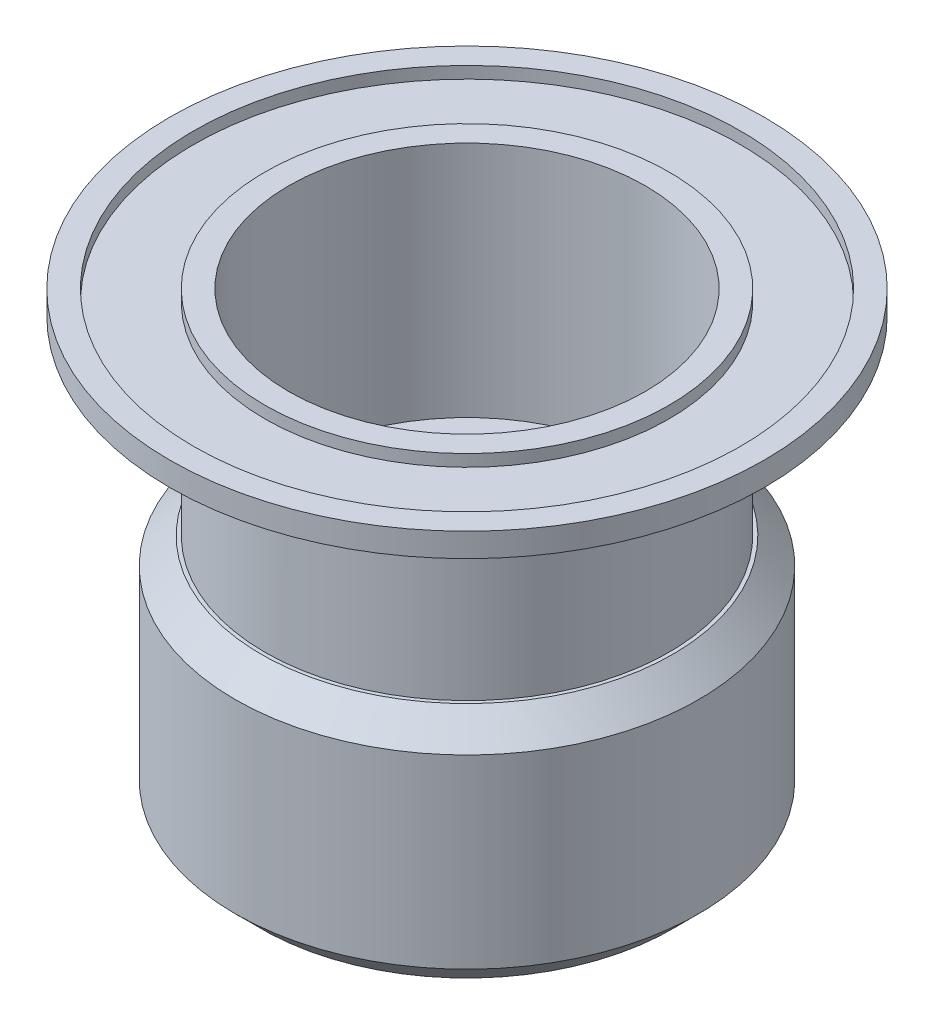
ISO-10303-21;
HEADER;
FILE_DESCRIPTION(('STEP AP214'),'2;1');
FILE_NAME('part.step','',(''),(''),'','','');
FILE_SCHEMA(('AUTOMOTIVE_DESIGN { 1 0 10303 214 1 1 1 1 }'));
ENDSEC;
DATA;
#1=APPLICATION_CONTEXT('core data for automotive mechanical design processes');
#2=APPLICATION_PROTOCOL_DEFINITION('international standard','automotive_design',2000,#1);
#3=PRODUCT_CONTEXT('',#1,'mechanical');
#4=PRODUCT('Part','Part','',(#3));
#5=PRODUCT_RELATED_PRODUCT_CATEGORY('part','',(#4));
#6=PRODUCT_DEFINITION_FORMATION('','',#4);
#7=PRODUCT_DEFINITION_CONTEXT('part definition',#1,'design');
#8=PRODUCT_DEFINITION('design','',#6,#7);
#9=PRODUCT_DEFINITION_SHAPE('','',#8);
#10=(LENGTH_UNIT() NAMED_UNIT(*) SI_UNIT(.MILLI.,.METRE.));
#11=(NAMED_UNIT(*) PLANE_ANGLE_UNIT() SI_UNIT($,.RADIAN.));
#12=(NAMED_UNIT(*) SI_UNIT($,.STERADIAN.) SOLID_ANGLE_UNIT());
#13=UNCERTAINTY_MEASURE_WITH_UNIT(LENGTH_MEASURE(1.E-05),#10,'distance_accuracy_value','');
#14=(GEOMETRIC_REPRESENTATION_CONTEXT(3) GLOBAL_UNCERTAINTY_ASSIGNED_CONTEXT((#13)) GLOBAL_UNIT_ASSIGNED_CONTEXT((#10,
#11,#12)) REPRESENTATION_CONTEXT('',''));
#15=CARTESIAN_POINT('',(0.,0.,0.));
#16=DIRECTION('',(0.,0.,1.));
#17=DIRECTION('',(1.,0.,0.));
#18=AXIS2_PLACEMENT_3D('',#15,#16,#17);
#19=CARTESIAN_POINT('',(0.,0.,0.));
#20=DIRECTION('',(0.,1.,0.));
#21=DIRECTION('',(0.,0.,1.));
#22=AXIS2_PLACEMENT_3D('',#19,#20,#21);
#23=CYLINDRICAL_SURFACE('',#22,17.);
#24=CARTESIAN_POINT('',(0.,-2.,0.));
#25=DIRECTION('',(0.,1.,0.));
#26=DIRECTION('',(0.,0.,1.));
#27=AXIS2_PLACEMENT_3D('',#24,#25,#26);
#28=CIRCLE('',#27,17.);
#29=CARTESIAN_POINT('',(0.,-2.,17.));
#30=VERTEX_POINT('',#29);
#31=EDGE_CURVE('E134',#30,#30,#28,.T.);
#32=ORIENTED_EDGE('',*,*,#31,.F.);
#33=EDGE_LOOP('',(#32));
#34=FACE_BOUND('',#33,.T.);
#35=CARTESIAN_POINT('',(0.,-18.,0.));
#36=DIRECTION('',(0.,-1.,0.));
#37=DIRECTION('',(0.,0.,-1.));
#38=AXIS2_PLACEMENT_3D('',#35,#36,#37);
#39=CIRCLE('',#38,17.);
#40=CARTESIAN_POINT('',(0.,-18.,-17.));
#41=VERTEX_POINT('',#40);
#42=EDGE_CURVE('E146',#41,#41,#39,.T.);
#43=ORIENTED_EDGE('',*,*,#42,.F.);
#44=EDGE_LOOP('',(#43));
#45=FACE_BOUND('',#44,.T.);
#46=ADVANCED_FACE('F36',(#34,#45),#23,.T.);
#47=CARTESIAN_POINT('',(15.,0.,0.));
#48=DIRECTION('',(0.,-1.,0.));
#49=DIRECTION('',(0.,0.,-1.));
#50=AXIS2_PLACEMENT_3D('',#47,#48,#49);
#51=PLANE('',#50);
#52=CARTESIAN_POINT('',(0.,0.,0.));
#53=DIRECTION('',(0.,1.,0.));
#54=DIRECTION('',(0.,0.,1.));
#55=AXIS2_PLACEMENT_3D('',#52,#53,#54);
#56=CIRCLE('',#55,23.);
#57=CARTESIAN_POINT('',(0.,0.,23.));
#58=VERTEX_POINT('',#57);
#59=EDGE_CURVE('E120',#58,#58,#56,.T.);
#60=ORIENTED_EDGE('',*,*,#59,.F.);
#61=EDGE_LOOP('',(#60));
#62=FACE_BOUND('',#61,.T.);
#63=CARTESIAN_POINT('',(0.,0.,0.));
#64=DIRECTION('',(0.,1.,0.));
#65=DIRECTION('',(0.,0.,1.));
#66=AXIS2_PLACEMENT_3D('',#63,#64,#65);
#67=CIRCLE('',#66,25.);
#68=CARTESIAN_POINT('',(0.,0.,25.));
#69=VERTEX_POINT('',#68);
#70=EDGE_CURVE('E140',#69,#69,#67,.T.);
#71=ORIENTED_EDGE('',*,*,#70,.T.);
#72=EDGE_LOOP('',(#71));
#73=FACE_BOUND('',#72,.T.);
#74=ADVANCED_FACE('F239',(#62,#73),#51,.F.);
#75=CARTESIAN_POINT('',(0.,0.,0.));
#76=DIRECTION('',(0.,1.,0.));
#77=DIRECTION('',(0.,0.,1.));
#78=AXIS2_PLACEMENT_3D('',#75,#76,#77);
#79=CYLINDRICAL_SURFACE('',#78,25.);
#80=ORIENTED_EDGE('',*,*,#70,.F.);
#81=EDGE_LOOP('',(#80));
#82=FACE_BOUND('',#81,.T.);
#83=CARTESIAN_POINT('',(0.,-2.,0.));
#84=DIRECTION('',(0.,1.,0.));
#85=DIRECTION('',(0.,0.,1.));
#86=AXIS2_PLACEMENT_3D('',#83,#84,#85);
#87=CIRCLE('',#86,25.);
#88=CARTESIAN_POINT('',(0.,-2.,25.));
#89=VERTEX_POINT('',#88);
#90=EDGE_CURVE('E137',#89,#89,#87,.T.);
#91=ORIENTED_EDGE('',*,*,#90,.T.);
#92=EDGE_LOOP('',(#91));
#93=FACE_BOUND('',#92,.T.);
#94=ADVANCED_FACE('F259',(#82,#93),#79,.T.);
#95=CARTESIAN_POINT('',(17.,-2.,0.));
#96=DIRECTION('',(0.,1.,0.));
#97=DIRECTION('',(0.,0.,1.));
#98=AXIS2_PLACEMENT_3D('',#95,#96,#97);
#99=PLANE('',#98);
#100=ORIENTED_EDGE('',*,*,#90,.F.);
#101=EDGE_LOOP('',(#100));
#102=FACE_BOUND('',#101,.T.);
#103=ORIENTED_EDGE('',*,*,#31,.T.);
#104=EDGE_LOOP('',(#103));
#105=FACE_BOUND('',#104,.T.);
#106=ADVANCED_FACE('F264',(#102,#105),#99,.F.);
#107=CARTESIAN_POINT('',(0.,-1.,0.));
#108=DIRECTION('',(0.,1.,0.));
#109=DIRECTION('',(0.,0.,1.));
#110=AXIS2_PLACEMENT_3D('',#107,#108,#109);
#111=CYLINDRICAL_SURFACE('',#110,23.);
#112=CARTESIAN_POINT('',(0.,-1.,0.));
#113=DIRECTION('',(0.,1.,0.));
#114=DIRECTION('',(0.,0.,1.));
#115=AXIS2_PLACEMENT_3D('',#112,#113,#114);
#116=CIRCLE('',#115,23.);
#117=CARTESIAN_POINT('',(0.,-1.,23.));
#118=VERTEX_POINT('',#117);
#119=EDGE_CURVE('E123',#118,#118,#116,.T.);
#120=ORIENTED_EDGE('',*,*,#119,.F.);
#121=EDGE_LOOP('',(#120));
#122=FACE_BOUND('',#121,.T.);
#123=ORIENTED_EDGE('',*,*,#59,.T.);
#124=EDGE_LOOP('',(#123));
#125=FACE_BOUND('',#124,.T.);
#126=ADVANCED_FACE('F249',(#122,#125),#111,.F.);
#127=CARTESIAN_POINT('',(0.,-1.,0.));
#128=DIRECTION('',(0.,1.,0.));
#129=DIRECTION('',(0.,0.,1.));
#130=AXIS2_PLACEMENT_3D('',#127,#128,#129);
#131=PLANE('',#130);
#132=CARTESIAN_POINT('',(0.,-1.,0.));
#133=DIRECTION('',(0.,1.,0.));
#134=DIRECTION('',(0.,0.,1.));
#135=AXIS2_PLACEMENT_3D('',#132,#133,#134);
#136=CIRCLE('',#135,17.);
#137=CARTESIAN_POINT('',(0.,-1.,17.));
#138=VERTEX_POINT('',#137);
#139=EDGE_CURVE('E117',#138,#138,#136,.T.);
#140=ORIENTED_EDGE('',*,*,#139,.F.);
#141=EDGE_LOOP('',(#140));
#142=FACE_BOUND('',#141,.T.);
#143=ORIENTED_EDGE('',*,*,#119,.T.);
#144=EDGE_LOOP('',(#143));
#145=FACE_BOUND('',#144,.T.);
#146=ADVANCED_FACE('F243',(#142,#145),#131,.T.);
#147=CARTESIAN_POINT('',(0.,-1.,0.));
#148=DIRECTION('',(0.,1.,0.));
#149=DIRECTION('',(0.,0.,1.));
#150=AXIS2_PLACEMENT_3D('',#147,#148,#149);
#151=CYLINDRICAL_SURFACE('',#150,17.);
#152=ORIENTED_EDGE('',*,*,#139,.T.);
#153=EDGE_LOOP('',(#152));
#154=FACE_BOUND('',#153,.T.);
#155=CARTESIAN_POINT('',(0.,0.,0.));
#156=DIRECTION('',(0.,1.,0.));
#157=DIRECTION('',(0.,0.,1.));
#158=AXIS2_PLACEMENT_3D('',#155,#156,#157);
#159=CIRCLE('',#158,17.);
#160=CARTESIAN_POINT('',(0.,0.,17.));
#161=VERTEX_POINT('',#160);
#162=EDGE_CURVE('E114',#161,#161,#159,.T.);
#163=ORIENTED_EDGE('',*,*,#162,.F.);
#164=EDGE_LOOP('',(#163));
#165=FACE_BOUND('',#164,.T.);
#166=ADVANCED_FACE('F223',(#154,#165),#151,.T.);
#167=CARTESIAN_POINT('',(15.,-20.,0.));
#168=DIRECTION('',(0.,-1.,0.));
#169=DIRECTION('',(0.,0.,-1.));
#170=AXIS2_PLACEMENT_3D('',#167,#168,#169);
#171=PLANE('',#170);
#172=CARTESIAN_POINT('',(-10.,-20.,0.));
#173=DIRECTION('',(0.,1.,0.));
#174=DIRECTION('',(0.,0.,1.));
#175=AXIS2_PLACEMENT_3D('',#172,#173,#174);
#176=CIRCLE('',#175,4.);
#177=CARTESIAN_POINT('',(-10.,-20.,4.));
#178=VERTEX_POINT('',#177);
#179=EDGE_CURVE('E205',#178,#178,#176,.T.);
#180=ORIENTED_EDGE('',*,*,#179,.F.);
#181=EDGE_LOOP('',(#180));
#182=FACE_BOUND('',#181,.T.);
#183=CARTESIAN_POINT('',(0.,-20.,10.));
#184=DIRECTION('',(0.,1.,0.));
#185=DIRECTION('',(0.,0.,1.));
#186=AXIS2_PLACEMENT_3D('',#183,#184,#185);
#187=CIRCLE('',#186,4.);
#188=CARTESIAN_POINT('',(0.,-20.,14.));
#189=VERTEX_POINT('',#188);
#190=EDGE_CURVE('E208',#189,#189,#187,.T.);
#191=ORIENTED_EDGE('',*,*,#190,.F.);
#192=EDGE_LOOP('',(#191));
#193=FACE_BOUND('',#192,.T.);
#194=CARTESIAN_POINT('',(10.,-20.,0.));
#195=DIRECTION('',(0.,1.,0.));
#196=DIRECTION('',(0.,0.,1.));
#197=AXIS2_PLACEMENT_3D('',#194,#195,#196);
#198=CIRCLE('',#197,4.);
#199=CARTESIAN_POINT('',(10.,-20.,4.00000000000001));
#200=VERTEX_POINT('',#199);
#201=EDGE_CURVE('E211',#200,#200,#198,.T.);
#202=ORIENTED_EDGE('',*,*,#201,.F.);
#203=EDGE_LOOP('',(#202));
#204=FACE_BOUND('',#203,.T.);
#205=CARTESIAN_POINT('',(0.,-20.,-10.));
#206=DIRECTION('',(0.,1.,0.));
#207=DIRECTION('',(0.,0.,1.));
#208=AXIS2_PLACEMENT_3D('',#205,#206,#207);
#209=CIRCLE('',#208,4.);
#210=CARTESIAN_POINT('',(0.,-20.,-6.));
#211=VERTEX_POINT('',#210);
#212=EDGE_CURVE('E108',#211,#211,#209,.T.);
#213=ORIENTED_EDGE('',*,*,#212,.F.);
#214=EDGE_LOOP('',(#213));
#215=FACE_BOUND('',#214,.T.);
#216=DIRECTION('',(-1.,0.,0.));
#217=VECTOR('',#216,1.);
#218=CARTESIAN_POINT('',(-5.,-20.,-5.));
#219=LINE('',#218,#217);
#220=CARTESIAN_POINT('',(5.,-20.,-5.));
#221=VERTEX_POINT('',#220);
#222=CARTESIAN_POINT('',(-5.,-20.,-5.));
#223=VERTEX_POINT('',#222);
#224=EDGE_CURVE('E86',#221,#223,#219,.T.);
#225=ORIENTED_EDGE('',*,*,#224,.F.);
#226=DIRECTION('',(0.,0.,-1.));
#227=VECTOR('',#226,1.);
#228=CARTESIAN_POINT('',(5.,-20.,5.));
#229=LINE('',#228,#227);
#230=CARTESIAN_POINT('',(5.,-20.,5.));
#231=VERTEX_POINT('',#230);
#232=EDGE_CURVE('E51',#231,#221,#229,.T.);
#233=ORIENTED_EDGE('',*,*,#232,.F.);
#234=DIRECTION('',(1.,0.,0.));
#235=VECTOR('',#234,1.);
#236=CARTESIAN_POINT('',(-5.,-20.,5.));
#237=LINE('',#236,#235);
#238=CARTESIAN_POINT('',(-5.,-20.,5.));
#239=VERTEX_POINT('',#238);
#240=EDGE_CURVE('E102',#239,#231,#237,.T.);
#241=ORIENTED_EDGE('',*,*,#240,.F.);
#242=DIRECTION('',(0.,0.,1.));
#243=VECTOR('',#242,1.);
#244=CARTESIAN_POINT('',(-5.,-20.,5.));
#245=LINE('',#244,#243);
#246=EDGE_CURVE('E110',#223,#239,#245,.T.);
#247=ORIENTED_EDGE('',*,*,#246,.F.);
#248=EDGE_LOOP('',(#225,#233,#241,#247));
#249=FACE_BOUND('',#248,.T.);
#250=CARTESIAN_POINT('',(0.,-20.,0.));
#251=DIRECTION('',(0.,1.,0.));
#252=DIRECTION('',(0.,0.,1.));
#253=AXIS2_PLACEMENT_3D('',#250,#251,#252);
#254=CIRCLE('',#253,15.);
#255=CARTESIAN_POINT('',(0.,-20.,15.));
#256=VERTEX_POINT('',#255);
#257=EDGE_CURVE('E131',#256,#256,#254,.T.);
#258=ORIENTED_EDGE('',*,*,#257,.T.);
#259=EDGE_LOOP('',(#258));
#260=FACE_BOUND('',#259,.T.);
#261=ADVANCED_FACE('F219',(#182,#193,#204,#215,#249,#260),#171,.F.);
#262=CARTESIAN_POINT('',(0.,0.,0.));
#263=DIRECTION('',(0.,1.,0.));
#264=DIRECTION('',(0.,0.,1.));
#265=AXIS2_PLACEMENT_3D('',#262,#263,#264);
#266=CYLINDRICAL_SURFACE('',#265,15.);
#267=ORIENTED_EDGE('',*,*,#257,.F.);
#268=EDGE_LOOP('',(#267));
#269=FACE_BOUND('',#268,.T.);
#270=CARTESIAN_POINT('',(0.,0.,0.));
#271=DIRECTION('',(0.,1.,0.));
#272=DIRECTION('',(0.,0.,1.));
#273=AXIS2_PLACEMENT_3D('',#270,#271,#272);
#274=CIRCLE('',#273,15.);
#275=CARTESIAN_POINT('',(0.,0.,15.));
#276=VERTEX_POINT('',#275);
#277=EDGE_CURVE('E126',#276,#276,#274,.T.);
#278=ORIENTED_EDGE('',*,*,#277,.T.);
#279=EDGE_LOOP('',(#278));
#280=FACE_BOUND('',#279,.T.);
#281=ADVANCED_FACE('F222',(#269,#280),#266,.F.);
#282=ORIENTED_EDGE('',*,*,#277,.F.);
#283=EDGE_LOOP('',(#282));
#284=FACE_BOUND('',#283,.T.);
#285=ORIENTED_EDGE('',*,*,#162,.T.);
#286=EDGE_LOOP('',(#285));
#287=FACE_BOUND('',#286,.T.);
#288=ADVANCED_FACE('F231',(#284,#287),#51,.F.);
#289=CARTESIAN_POINT('',(5.,-21.5,5.));
#290=DIRECTION('',(1.,0.,0.));
#291=DIRECTION('',(0.,0.,-1.));
#292=AXIS2_PLACEMENT_3D('',#289,#290,#291);
#293=PLANE('',#292);
#294=ORIENTED_EDGE('',*,*,#232,.T.);
#295=DIRECTION('',(0.,1.,0.));
#296=VECTOR('',#295,1.);
#297=CARTESIAN_POINT('',(5.,-21.5,-5.));
#298=LINE('',#297,#296);
#299=CARTESIAN_POINT('',(5.,-21.5,-5.));
#300=VERTEX_POINT('',#299);
#301=EDGE_CURVE('E74',#300,#221,#298,.T.);
#302=ORIENTED_EDGE('',*,*,#301,.F.);
#303=DIRECTION('',(0.,0.,-1.));
#304=VECTOR('',#303,1.);
#305=CARTESIAN_POINT('',(5.,-21.5,5.));
#306=LINE('',#305,#304);
#307=CARTESIAN_POINT('',(5.,-21.5,5.));
#308=VERTEX_POINT('',#307);
#309=EDGE_CURVE('E100',#308,#300,#306,.T.);
#310=ORIENTED_EDGE('',*,*,#309,.F.);
#311=DIRECTION('',(0.,1.,0.));
#312=VECTOR('',#311,1.);
#313=CARTESIAN_POINT('',(5.,-21.5,5.));
#314=LINE('',#313,#312);
#315=EDGE_CURVE('E59',#308,#231,#314,.T.);
#316=ORIENTED_EDGE('',*,*,#315,.T.);
#317=EDGE_LOOP('',(#294,#302,#310,#316));
#318=FACE_BOUND('',#317,.T.);
#319=ADVANCED_FACE('F237',(#318),#293,.F.);
#320=CARTESIAN_POINT('',(-5.,-21.5,5.));
#321=DIRECTION('',(0.,0.,1.));
#322=DIRECTION('',(1.,0.,0.));
#323=AXIS2_PLACEMENT_3D('',#320,#321,#322);
#324=PLANE('',#323);
#325=ORIENTED_EDGE('',*,*,#240,.T.);
#326=ORIENTED_EDGE('',*,*,#315,.F.);
#327=DIRECTION('',(1.,0.,0.));
#328=VECTOR('',#327,1.);
#329=CARTESIAN_POINT('',(-5.,-21.5,5.));
#330=LINE('',#329,#328);
#331=CARTESIAN_POINT('',(-5.,-21.5,5.));
#332=VERTEX_POINT('',#331);
#333=EDGE_CURVE('E97',#332,#308,#330,.T.);
#334=ORIENTED_EDGE('',*,*,#333,.F.);
#335=DIRECTION('',(0.,1.,0.));
#336=VECTOR('',#335,1.);
#337=CARTESIAN_POINT('',(-5.,-21.5,5.));
#338=LINE('',#337,#336);
#339=EDGE_CURVE('E90',#332,#239,#338,.T.);
#340=ORIENTED_EDGE('',*,*,#339,.T.);
#341=EDGE_LOOP('',(#325,#326,#334,#340));
#342=FACE_BOUND('',#341,.T.);
#343=ADVANCED_FACE('F325',(#342),#324,.F.);
#344=CARTESIAN_POINT('',(-5.,-21.5,5.));
#345=DIRECTION('',(-1.,0.,0.));
#346=DIRECTION('',(0.,0.,1.));
#347=AXIS2_PLACEMENT_3D('',#344,#345,#346);
#348=PLANE('',#347);
#349=ORIENTED_EDGE('',*,*,#246,.T.);
#350=ORIENTED_EDGE('',*,*,#339,.F.);
#351=DIRECTION('',(0.,0.,1.));
#352=VECTOR('',#351,1.);
#353=CARTESIAN_POINT('',(-5.,-21.5,5.));
#354=LINE('',#353,#352);
#355=CARTESIAN_POINT('',(-5.,-21.5,-5.));
#356=VERTEX_POINT('',#355);
#357=EDGE_CURVE('E93',#356,#332,#354,.T.);
#358=ORIENTED_EDGE('',*,*,#357,.F.);
#359=DIRECTION('',(0.,1.,0.));
#360=VECTOR('',#359,1.);
#361=CARTESIAN_POINT('',(-5.,-21.5,-5.));
#362=LINE('',#361,#360);
#363=EDGE_CURVE('E79',#356,#223,#362,.T.);
#364=ORIENTED_EDGE('',*,*,#363,.T.);
#365=EDGE_LOOP('',(#349,#350,#358,#364));
#366=FACE_BOUND('',#365,.T.);
#367=ADVANCED_FACE('F94',(#366),#348,.F.);
#368=CARTESIAN_POINT('',(-5.,-21.5,-5.));
#369=DIRECTION('',(0.,0.,-1.));
#370=DIRECTION('',(-1.,0.,0.));
#371=AXIS2_PLACEMENT_3D('',#368,#369,#370);
#372=PLANE('',#371);
#373=ORIENTED_EDGE('',*,*,#224,.T.);
#374=ORIENTED_EDGE('',*,*,#363,.F.);
#375=DIRECTION('',(-1.,0.,0.));
#376=VECTOR('',#375,1.);
#377=CARTESIAN_POINT('',(-5.,-21.5,-5.));
#378=LINE('',#377,#376);
#379=EDGE_CURVE('E83',#300,#356,#378,.T.);
#380=ORIENTED_EDGE('',*,*,#379,.F.);
#381=ORIENTED_EDGE('',*,*,#301,.T.);
#382=EDGE_LOOP('',(#373,#374,#380,#381));
#383=FACE_BOUND('',#382,.T.);
#384=ADVANCED_FACE('F81',(#383),#372,.F.);
#385=CARTESIAN_POINT('',(0.,-21.5,0.));
#386=DIRECTION('',(0.,-1.,0.));
#387=DIRECTION('',(0.,0.,-1.));
#388=AXIS2_PLACEMENT_3D('',#385,#386,#387);
#389=PLANE('',#388);
#390=CARTESIAN_POINT('',(0.,-21.5,0.));
#391=DIRECTION('',(0.,1.,0.));
#392=DIRECTION('',(0.,0.,1.));
#393=AXIS2_PLACEMENT_3D('',#390,#391,#392);
#394=CIRCLE('',#393,2.75);
#395=CARTESIAN_POINT('',(0.,-21.5,2.75));
#396=VERTEX_POINT('',#395);
#397=EDGE_CURVE('E151',#396,#396,#394,.T.);
#398=ORIENTED_EDGE('',*,*,#397,.F.);
#399=EDGE_LOOP('',(#398));
#400=FACE_BOUND('',#399,.T.);
#401=ORIENTED_EDGE('',*,*,#309,.T.);
#402=ORIENTED_EDGE('',*,*,#379,.T.);
#403=ORIENTED_EDGE('',*,*,#357,.T.);
#404=ORIENTED_EDGE('',*,*,#333,.T.);
#405=EDGE_LOOP('',(#401,#402,#403,#404));
#406=FACE_BOUND('',#405,.T.);
#407=ADVANCED_FACE('F99',(#400,#406),#389,.F.);
#408=CARTESIAN_POINT('',(0.,-22.,-10.));
#409=DIRECTION('',(0.,1.,0.));
#410=DIRECTION('',(0.,0.,1.));
#411=AXIS2_PLACEMENT_3D('',#408,#409,#410);
#412=CYLINDRICAL_SURFACE('',#411,4.);
#413=ORIENTED_EDGE('',*,*,#212,.T.);
#414=EDGE_LOOP('',(#413));
#415=FACE_BOUND('',#414,.T.);
#416=CARTESIAN_POINT('',(0.,-23.,-10.));
#417=DIRECTION('',(0.,-1.,0.));
#418=DIRECTION('',(0.,0.,-1.));
#419=AXIS2_PLACEMENT_3D('',#416,#417,#418);
#420=CIRCLE('',#419,4.);
#421=CARTESIAN_POINT('',(0.,-23.,-14.));
#422=VERTEX_POINT('',#421);
#423=EDGE_CURVE('E193',#422,#422,#420,.T.);
#424=ORIENTED_EDGE('',*,*,#423,.T.);
#425=EDGE_LOOP('',(#424));
#426=FACE_BOUND('',#425,.T.);
#427=ADVANCED_FACE('F216',(#415,#426),#412,.F.);
#428=CARTESIAN_POINT('',(10.,-22.,0.));
#429=DIRECTION('',(0.,1.,0.));
#430=DIRECTION('',(0.,0.,1.));
#431=AXIS2_PLACEMENT_3D('',#428,#429,#430);
#432=CYLINDRICAL_SURFACE('',#431,4.);
#433=ORIENTED_EDGE('',*,*,#201,.T.);
#434=EDGE_LOOP('',(#433));
#435=FACE_BOUND('',#434,.T.);
#436=CARTESIAN_POINT('',(10.,-23.,0.));
#437=DIRECTION('',(0.,-1.,0.));
#438=DIRECTION('',(0.,0.,-1.));
#439=AXIS2_PLACEMENT_3D('',#436,#437,#438);
#440=CIRCLE('',#439,4.);
#441=CARTESIAN_POINT('',(10.,-23.,-4.));
#442=VERTEX_POINT('',#441);
#443=EDGE_CURVE('E190',#442,#442,#440,.T.);
#444=ORIENTED_EDGE('',*,*,#443,.T.);
#445=EDGE_LOOP('',(#444));
#446=FACE_BOUND('',#445,.T.);
#447=ADVANCED_FACE('F367',(#435,#446),#432,.F.);
#448=CARTESIAN_POINT('',(0.,-22.,10.));
#449=DIRECTION('',(0.,1.,0.));
#450=DIRECTION('',(0.,0.,1.));
#451=AXIS2_PLACEMENT_3D('',#448,#449,#450);
#452=CYLINDRICAL_SURFACE('',#451,4.);
#453=ORIENTED_EDGE('',*,*,#190,.T.);
#454=EDGE_LOOP('',(#453));
#455=FACE_BOUND('',#454,.T.);
#456=CARTESIAN_POINT('',(0.,-23.,10.));
#457=DIRECTION('',(0.,-1.,0.));
#458=DIRECTION('',(0.,0.,-1.));
#459=AXIS2_PLACEMENT_3D('',#456,#457,#458);
#460=CIRCLE('',#459,4.);
#461=CARTESIAN_POINT('',(0.,-23.,6.));
#462=VERTEX_POINT('',#461);
#463=EDGE_CURVE('E202',#462,#462,#460,.T.);
#464=ORIENTED_EDGE('',*,*,#463,.T.);
#465=EDGE_LOOP('',(#464));
#466=FACE_BOUND('',#465,.T.);
#467=ADVANCED_FACE('F377',(#455,#466),#452,.F.);
#468=CARTESIAN_POINT('',(-10.,-22.,0.));
#469=DIRECTION('',(0.,1.,0.));
#470=DIRECTION('',(0.,0.,1.));
#471=AXIS2_PLACEMENT_3D('',#468,#469,#470);
#472=CYLINDRICAL_SURFACE('',#471,4.);
#473=ORIENTED_EDGE('',*,*,#179,.T.);
#474=EDGE_LOOP('',(#473));
#475=FACE_BOUND('',#474,.T.);
#476=CARTESIAN_POINT('',(-10.,-23.,0.));
#477=DIRECTION('',(0.,-1.,0.));
#478=DIRECTION('',(0.,0.,-1.));
#479=AXIS2_PLACEMENT_3D('',#476,#477,#478);
#480=CIRCLE('',#479,4.);
#481=CARTESIAN_POINT('',(-10.,-23.,-4.));
#482=VERTEX_POINT('',#481);
#483=EDGE_CURVE('E199',#482,#482,#480,.T.);
#484=ORIENTED_EDGE('',*,*,#483,.T.);
#485=EDGE_LOOP('',(#484));
#486=FACE_BOUND('',#485,.T.);
#487=ADVANCED_FACE('F388',(#475,#486),#472,.F.);
#488=CARTESIAN_POINT('',(0.,-23.,0.));
#489=DIRECTION('',(0.,-1.,0.));
#490=DIRECTION('',(0.,0.,-1.));
#491=AXIS2_PLACEMENT_3D('',#488,#489,#490);
#492=PLANE('',#491);
#493=CARTESIAN_POINT('',(0.,-23.,0.));
#494=DIRECTION('',(0.,-1.,0.));
#495=DIRECTION('',(0.,0.,-1.));
#496=AXIS2_PLACEMENT_3D('',#493,#494,#495);
#497=CIRCLE('',#496,2.75);
#498=CARTESIAN_POINT('',(0.,-23.,-2.75));
#499=VERTEX_POINT('',#498);
#500=EDGE_CURVE('E147',#499,#499,#497,.T.);
#501=ORIENTED_EDGE('',*,*,#500,.F.);
#502=EDGE_LOOP('',(#501));
#503=FACE_BOUND('',#502,.T.);
#504=CARTESIAN_POINT('',(0.,-23.,0.));
#505=DIRECTION('',(0.,-1.,0.));
#506=DIRECTION('',(0.,0.,-1.));
#507=AXIS2_PLACEMENT_3D('',#504,#505,#506);
#508=CIRCLE('',#507,15.);
#509=CARTESIAN_POINT('',(0.,-23.,-15.));
#510=VERTEX_POINT('',#509);
#511=EDGE_CURVE('E143',#510,#510,#508,.F.);
#512=ORIENTED_EDGE('',*,*,#511,.F.);
#513=EDGE_LOOP('',(#512));
#514=FACE_BOUND('',#513,.T.);
#515=ORIENTED_EDGE('',*,*,#423,.F.);
#516=EDGE_LOOP('',(#515));
#517=FACE_BOUND('',#516,.T.);
#518=ORIENTED_EDGE('',*,*,#463,.F.);
#519=EDGE_LOOP('',(#518));
#520=FACE_BOUND('',#519,.T.);
#521=ORIENTED_EDGE('',*,*,#483,.F.);
#522=EDGE_LOOP('',(#521));
#523=FACE_BOUND('',#522,.T.);
#524=ORIENTED_EDGE('',*,*,#443,.F.);
#525=EDGE_LOOP('',(#524));
#526=FACE_BOUND('',#525,.T.);
#527=ADVANCED_FACE('F185',(#503,#514,#517,#520,#523,#526),#492,.T.);
#528=CARTESIAN_POINT('',(0.,-38.,0.));
#529=DIRECTION('',(0.,-1.,0.));
#530=DIRECTION('',(0.,0.,-1.));
#531=AXIS2_PLACEMENT_3D('',#528,#529,#530);
#532=PLANE('',#531);
#533=CARTESIAN_POINT('',(0.,-38.,0.));
#534=DIRECTION('',(0.,-1.,0.));
#535=DIRECTION('',(0.,0.,-1.));
#536=AXIS2_PLACEMENT_3D('',#533,#534,#535);
#537=CIRCLE('',#536,17.305);
#538=CARTESIAN_POINT('',(0.,-38.,-17.305));
#539=VERTEX_POINT('',#538);
#540=EDGE_CURVE('E11',#539,#539,#537,.T.);
#541=ORIENTED_EDGE('',*,*,#540,.T.);
#542=EDGE_LOOP('',(#541));
#543=FACE_BOUND('',#542,.T.);
#544=CARTESIAN_POINT('',(0.,-38.,0.));
#545=DIRECTION('',(0.,-1.,0.));
#546=DIRECTION('',(0.,0.,-1.));
#547=AXIS2_PLACEMENT_3D('',#544,#545,#546);
#548=CIRCLE('',#547,15.);
#549=CARTESIAN_POINT('',(0.,-38.,-15.));
#550=VERTEX_POINT('',#549);
#551=EDGE_CURVE('E150',#550,#550,#548,.T.);
#552=ORIENTED_EDGE('',*,*,#551,.F.);
#553=EDGE_LOOP('',(#552));
#554=FACE_BOUND('',#553,.T.);
#555=ADVANCED_FACE('F181',(#543,#554),#532,.T.);
#556=CARTESIAN_POINT('',(0.,-38.,0.));
#557=DIRECTION('',(0.,1.,0.));
#558=DIRECTION('',(0.,0.,1.));
#559=AXIS2_PLACEMENT_3D('',#556,#557,#558);
#560=CYLINDRICAL_SURFACE('',#559,15.);
#561=ORIENTED_EDGE('',*,*,#551,.T.);
#562=EDGE_LOOP('',(#561));
#563=FACE_BOUND('',#562,.T.);
#564=ORIENTED_EDGE('',*,*,#511,.T.);
#565=EDGE_LOOP('',(#564));
#566=FACE_BOUND('',#565,.T.);
#567=ADVANCED_FACE('F184',(#563,#566),#560,.F.);
#568=CARTESIAN_POINT('',(0.,-38.,0.));
#569=DIRECTION('',(0.,1.,0.));
#570=DIRECTION('',(0.,0.,1.));
#571=AXIS2_PLACEMENT_3D('',#568,#569,#570);
#572=CYLINDRICAL_SURFACE('',#571,2.75);
#573=ORIENTED_EDGE('',*,*,#500,.T.);
#574=EDGE_LOOP('',(#573));
#575=FACE_BOUND('',#574,.T.);
#576=ORIENTED_EDGE('',*,*,#397,.T.);
#577=EDGE_LOOP('',(#576));
#578=FACE_BOUND('',#577,.T.);
#579=ADVANCED_FACE('F173',(#575,#578),#572,.F.);
#580=CARTESIAN_POINT('',(0.,-18.,0.));
#581=DIRECTION('',(0.,-1.,0.));
#582=DIRECTION('',(0.,0.,-1.));
#583=AXIS2_PLACEMENT_3D('',#580,#581,#582);
#584=CYLINDRICAL_SURFACE('',#583,19.5);
#585=CARTESIAN_POINT('',(0.,-20.195,0.));
#586=DIRECTION('',(0.,-1.,0.));
#587=DIRECTION('',(0.,0.,-1.));
#588=AXIS2_PLACEMENT_3D('',#585,#586,#587);
#589=CIRCLE('',#588,19.5);
#590=CARTESIAN_POINT('',(0.,-20.195,-19.5));
#591=VERTEX_POINT('',#590);
#592=EDGE_CURVE('E157',#591,#591,#589,.T.);
#593=ORIENTED_EDGE('',*,*,#592,.T.);
#594=EDGE_LOOP('',(#593));
#595=FACE_BOUND('',#594,.T.);
#596=CARTESIAN_POINT('',(0.,-35.805,0.));
#597=DIRECTION('',(0.,-1.,0.));
#598=DIRECTION('',(0.,0.,-1.));
#599=AXIS2_PLACEMENT_3D('',#596,#597,#598);
#600=CIRCLE('',#599,19.5);
#601=CARTESIAN_POINT('',(0.,-35.805,-19.5));
#602=VERTEX_POINT('',#601);
#603=EDGE_CURVE('E154',#602,#602,#600,.F.);
#604=ORIENTED_EDGE('',*,*,#603,.T.);
#605=EDGE_LOOP('',(#604));
#606=FACE_BOUND('',#605,.T.);
#607=ADVANCED_FACE('F170',(#595,#606),#584,.T.);
#608=CARTESIAN_POINT('',(0.,-18.,0.));
#609=DIRECTION('',(0.,-1.,0.));
#610=DIRECTION('',(0.,0.,-1.));
#611=AXIS2_PLACEMENT_3D('',#608,#609,#610);
#612=PLANE('',#611);
#613=CARTESIAN_POINT('',(0.,-18.,0.));
#614=DIRECTION('',(0.,-1.,0.));
#615=DIRECTION('',(0.,0.,-1.));
#616=AXIS2_PLACEMENT_3D('',#613,#614,#615);
#617=CIRCLE('',#616,17.305);
#618=CARTESIAN_POINT('',(0.,-18.,-17.305));
#619=VERTEX_POINT('',#618);
#620=EDGE_CURVE('E44',#619,#619,#617,.F.);
#621=ORIENTED_EDGE('',*,*,#620,.T.);
#622=EDGE_LOOP('',(#621));
#623=FACE_BOUND('',#622,.T.);
#624=ORIENTED_EDGE('',*,*,#42,.T.);
#625=EDGE_LOOP('',(#624));
#626=FACE_BOUND('',#625,.T.);
#627=ADVANCED_FACE('F162',(#623,#626),#612,.F.);
#628=CARTESIAN_POINT('',(0.,-20.195,0.));
#629=DIRECTION('',(0.,-1.,0.));
#630=DIRECTION('',(0.,0.,-1.));
#631=AXIS2_PLACEMENT_3D('',#628,#629,#630);
#632=CONICAL_SURFACE('',#631,19.5,0.78539816339745);
#633=ORIENTED_EDGE('',*,*,#620,.F.);
#634=EDGE_LOOP('',(#633));
#635=FACE_BOUND('',#634,.T.);
#636=ORIENTED_EDGE('',*,*,#592,.F.);
#637=EDGE_LOOP('',(#636));
#638=FACE_BOUND('',#637,.T.);
#639=ADVANCED_FACE('F165',(#635,#638),#632,.T.);
#640=CARTESIAN_POINT('',(0.,-38.,0.));
#641=DIRECTION('',(0.,1.,0.));
#642=DIRECTION('',(0.,0.,1.));
#643=AXIS2_PLACEMENT_3D('',#640,#641,#642);
#644=CONICAL_SURFACE('',#643,17.305,0.785398163397446);
#645=ORIENTED_EDGE('',*,*,#603,.F.);
#646=EDGE_LOOP('',(#645));
#647=FACE_BOUND('',#646,.T.);
#648=ORIENTED_EDGE('',*,*,#540,.F.);
#649=EDGE_LOOP('',(#648));
#650=FACE_BOUND('',#649,.T.);
#651=ADVANCED_FACE('F38',(#647,#650),#644,.T.);
#652=CLOSED_SHELL('',(#46,#74,#94,#106,#126,#146,#166,#261,#281,#288,#319,#343,#367,#384,#407,
#427,#447,#467,#487,#527,#555,#567,#579,#607,#627,#639,#651));
#653=MANIFOLD_SOLID_BREP('B2',#652);
#654=ADVANCED_BREP_SHAPE_REPRESENTATION('',(#18,#653),#14);
#655=SHAPE_DEFINITION_REPRESENTATION(#9,#654);
ENDSEC;
END-ISO-10303-21;
